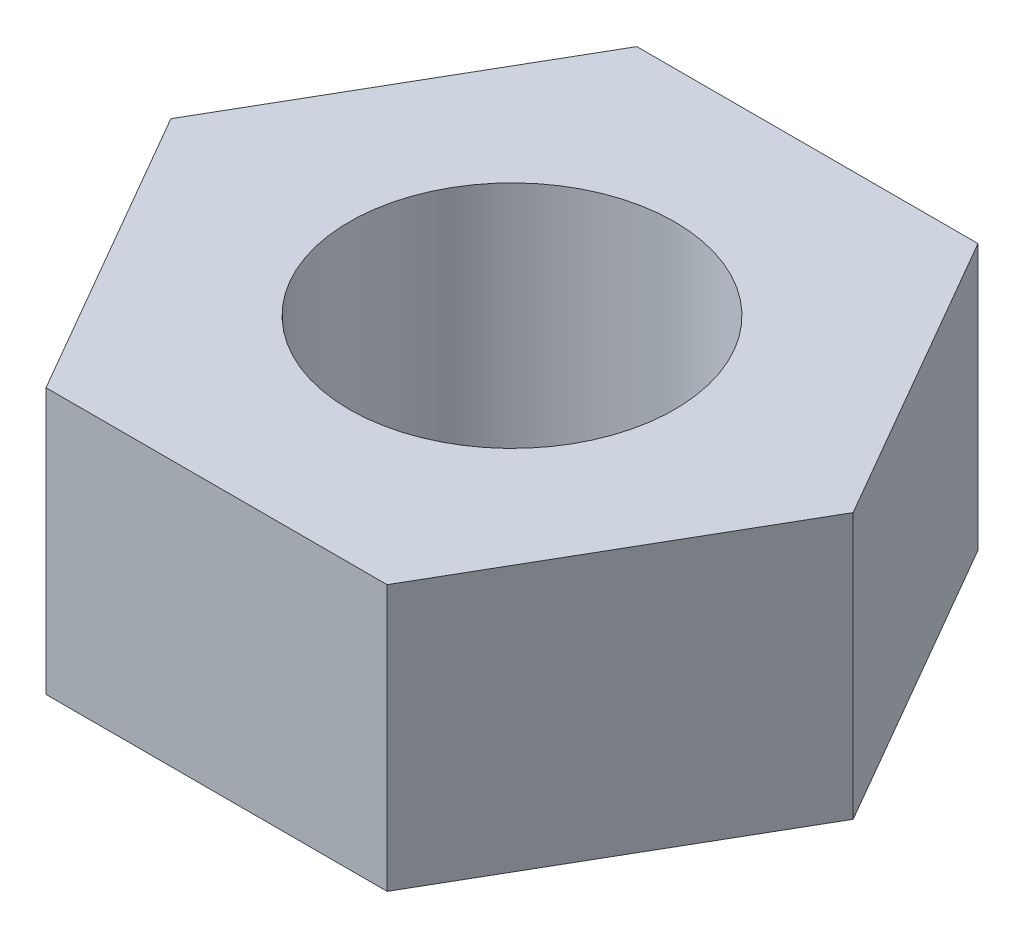
ISO-10303-21;
HEADER;
FILE_DESCRIPTION(('STEP AP214'),'2;1');
FILE_NAME('part.step','',(''),(''),'','','');
FILE_SCHEMA(('AUTOMOTIVE_DESIGN { 1 0 10303 214 1 1 1 1 }'));
ENDSEC;
DATA;
#1=APPLICATION_CONTEXT('core data for automotive mechanical design processes');
#2=APPLICATION_PROTOCOL_DEFINITION('international standard','automotive_design',2000,#1);
#3=PRODUCT_CONTEXT('',#1,'mechanical');
#4=PRODUCT('Part','Part','',(#3));
#5=PRODUCT_RELATED_PRODUCT_CATEGORY('part','',(#4));
#6=PRODUCT_DEFINITION_FORMATION('','',#4);
#7=PRODUCT_DEFINITION_CONTEXT('part definition',#1,'design');
#8=PRODUCT_DEFINITION('design','',#6,#7);
#9=PRODUCT_DEFINITION_SHAPE('','',#8);
#10=(LENGTH_UNIT() NAMED_UNIT(*) SI_UNIT(.MILLI.,.METRE.));
#11=(NAMED_UNIT(*) PLANE_ANGLE_UNIT() SI_UNIT($,.RADIAN.));
#12=(NAMED_UNIT(*) SI_UNIT($,.STERADIAN.) SOLID_ANGLE_UNIT());
#13=UNCERTAINTY_MEASURE_WITH_UNIT(LENGTH_MEASURE(1.E-05),#10,'distance_accuracy_value','');
#14=(GEOMETRIC_REPRESENTATION_CONTEXT(3) GLOBAL_UNCERTAINTY_ASSIGNED_CONTEXT((#13)) GLOBAL_UNIT_ASSIGNED_CONTEXT((#10,
#11,#12)) REPRESENTATION_CONTEXT('',''));
#15=CARTESIAN_POINT('',(0.,0.,0.));
#16=DIRECTION('',(0.,0.,1.));
#17=DIRECTION('',(1.,0.,0.));
#18=AXIS2_PLACEMENT_3D('',#15,#16,#17);
#19=CARTESIAN_POINT('',(0.,2.45,0.));
#20=DIRECTION('',(0.,1.,0.));
#21=DIRECTION('',(0.,0.,1.));
#22=AXIS2_PLACEMENT_3D('',#19,#20,#21);
#23=PLANE('',#22);
#24=DIRECTION('',(0.499999999999995,0.,-0.866025403784441));
#25=VECTOR('',#24,1.);
#26=CARTESIAN_POINT('',(1.57327948354176,2.45,2.72499999999998));
#27=LINE('',#26,#25);
#28=CARTESIAN_POINT('',(1.57327948354176,2.45,2.72499999999998));
#29=VERTEX_POINT('',#28);
#30=CARTESIAN_POINT('',(3.14655896708346,2.45,0.));
#31=VERTEX_POINT('',#30);
#32=EDGE_CURVE('E131',#29,#31,#27,.T.);
#33=ORIENTED_EDGE('',*,*,#32,.T.);
#34=DIRECTION('',(-0.500000000000001,0.,-0.866025403784438));
#35=VECTOR('',#34,1.);
#36=CARTESIAN_POINT('',(3.14655896708346,2.45,0.));
#37=LINE('',#36,#35);
#38=CARTESIAN_POINT('',(1.57327948354173,2.45,-2.72500000000001));
#39=VERTEX_POINT('',#38);
#40=EDGE_CURVE('E89',#31,#39,#37,.T.);
#41=ORIENTED_EDGE('',*,*,#40,.T.);
#42=DIRECTION('',(-1.,0.,0.));
#43=VECTOR('',#42,1.);
#44=CARTESIAN_POINT('',(1.57327948354173,2.45,-2.72500000000001));
#45=LINE('',#44,#43);
#46=CARTESIAN_POINT('',(-1.57327948354174,2.45,-2.725));
#47=VERTEX_POINT('',#46);
#48=EDGE_CURVE('E102',#39,#47,#45,.T.);
#49=ORIENTED_EDGE('',*,*,#48,.T.);
#50=DIRECTION('',(-0.499999999999995,0.,0.866025403784442));
#51=VECTOR('',#50,1.);
#52=CARTESIAN_POINT('',(-1.57327948354174,2.45,-2.725));
#53=LINE('',#52,#51);
#54=CARTESIAN_POINT('',(-3.14655896708346,2.45,0.));
#55=VERTEX_POINT('',#54);
#56=EDGE_CURVE('E96',#47,#55,#53,.T.);
#57=ORIENTED_EDGE('',*,*,#56,.T.);
#58=DIRECTION('',(0.500000000000007,0.,0.866025403784435));
#59=VECTOR('',#58,1.);
#60=CARTESIAN_POINT('',(-3.14655896708346,2.45,0.));
#61=LINE('',#60,#59);
#62=CARTESIAN_POINT('',(-1.57327948354171,2.45,2.72500000000002));
#63=VERTEX_POINT('',#62);
#64=EDGE_CURVE('E100',#55,#63,#61,.T.);
#65=ORIENTED_EDGE('',*,*,#64,.T.);
#66=DIRECTION('',(1.,0.,0.));
#67=VECTOR('',#66,1.);
#68=CARTESIAN_POINT('',(-1.57327948354171,2.45,2.72500000000002));
#69=LINE('',#68,#67);
#70=EDGE_CURVE('E52',#63,#29,#69,.T.);
#71=ORIENTED_EDGE('',*,*,#70,.T.);
#72=EDGE_LOOP('',(#33,#41,#49,#57,#65,#71));
#73=FACE_BOUND('',#72,.T.);
#74=CARTESIAN_POINT('',(0.,2.45,0.));
#75=DIRECTION('',(0.,1.,0.));
#76=DIRECTION('',(0.,0.,1.));
#77=AXIS2_PLACEMENT_3D('',#74,#75,#76);
#78=CIRCLE('',#77,1.5);
#79=CARTESIAN_POINT('',(0.,2.45,1.5));
#80=VERTEX_POINT('',#79);
#81=EDGE_CURVE('E124',#80,#80,#78,.T.);
#82=ORIENTED_EDGE('',*,*,#81,.F.);
#83=EDGE_LOOP('',(#82));
#84=FACE_BOUND('',#83,.T.);
#85=ADVANCED_FACE('F35',(#73,#84),#23,.T.);
#86=CARTESIAN_POINT('',(0.,0.,0.));
#87=DIRECTION('',(0.,1.,0.));
#88=DIRECTION('',(0.,0.,1.));
#89=AXIS2_PLACEMENT_3D('',#86,#87,#88);
#90=PLANE('',#89);
#91=DIRECTION('',(0.499999999999995,0.,-0.866025403784441));
#92=VECTOR('',#91,1.);
#93=CARTESIAN_POINT('',(1.57327948354176,0.,2.72499999999998));
#94=LINE('',#93,#92);
#95=CARTESIAN_POINT('',(1.57327948354176,0.,2.72499999999998));
#96=VERTEX_POINT('',#95);
#97=CARTESIAN_POINT('',(3.14655896708346,0.,0.));
#98=VERTEX_POINT('',#97);
#99=EDGE_CURVE('E120',#96,#98,#94,.T.);
#100=ORIENTED_EDGE('',*,*,#99,.F.);
#101=DIRECTION('',(1.,0.,0.));
#102=VECTOR('',#101,1.);
#103=CARTESIAN_POINT('',(-1.57327948354171,0.,2.72500000000002));
#104=LINE('',#103,#102);
#105=CARTESIAN_POINT('',(-1.57327948354171,0.,2.72500000000002));
#106=VERTEX_POINT('',#105);
#107=EDGE_CURVE('E81',#106,#96,#104,.T.);
#108=ORIENTED_EDGE('',*,*,#107,.F.);
#109=DIRECTION('',(0.500000000000007,0.,0.866025403784435));
#110=VECTOR('',#109,1.);
#111=CARTESIAN_POINT('',(-3.14655896708346,0.,0.));
#112=LINE('',#111,#110);
#113=CARTESIAN_POINT('',(-3.14655896708346,0.,0.));
#114=VERTEX_POINT('',#113);
#115=EDGE_CURVE('E75',#114,#106,#112,.T.);
#116=ORIENTED_EDGE('',*,*,#115,.F.);
#117=DIRECTION('',(-0.499999999999995,0.,0.866025403784442));
#118=VECTOR('',#117,1.);
#119=CARTESIAN_POINT('',(-1.57327948354174,0.,-2.725));
#120=LINE('',#119,#118);
#121=CARTESIAN_POINT('',(-1.57327948354174,0.,-2.725));
#122=VERTEX_POINT('',#121);
#123=EDGE_CURVE('E110',#122,#114,#120,.T.);
#124=ORIENTED_EDGE('',*,*,#123,.F.);
#125=DIRECTION('',(-1.,0.,0.));
#126=VECTOR('',#125,1.);
#127=CARTESIAN_POINT('',(1.57327948354173,0.,-2.72500000000001));
#128=LINE('',#127,#126);
#129=CARTESIAN_POINT('',(1.57327948354173,0.,-2.72500000000001));
#130=VERTEX_POINT('',#129);
#131=EDGE_CURVE('E126',#130,#122,#128,.T.);
#132=ORIENTED_EDGE('',*,*,#131,.F.);
#133=DIRECTION('',(-0.500000000000001,0.,-0.866025403784438));
#134=VECTOR('',#133,1.);
#135=CARTESIAN_POINT('',(3.14655896708346,0.,0.));
#136=LINE('',#135,#134);
#137=EDGE_CURVE('E123',#98,#130,#136,.T.);
#138=ORIENTED_EDGE('',*,*,#137,.F.);
#139=EDGE_LOOP('',(#100,#108,#116,#124,#132,#138));
#140=FACE_BOUND('',#139,.T.);
#141=CARTESIAN_POINT('',(0.,0.,0.));
#142=DIRECTION('',(0.,1.,0.));
#143=DIRECTION('',(0.,0.,1.));
#144=AXIS2_PLACEMENT_3D('',#141,#142,#143);
#145=CIRCLE('',#144,1.5);
#146=CARTESIAN_POINT('',(0.,0.,1.5));
#147=VERTEX_POINT('',#146);
#148=EDGE_CURVE('E224',#147,#147,#145,.T.);
#149=ORIENTED_EDGE('',*,*,#148,.T.);
#150=EDGE_LOOP('',(#149));
#151=FACE_BOUND('',#150,.T.);
#152=ADVANCED_FACE('F140',(#140,#151),#90,.F.);
#153=CARTESIAN_POINT('',(1.57327948354176,2.45,2.72499999999998));
#154=DIRECTION('',(-0.866025403784441,0.,-0.499999999999995));
#155=DIRECTION('',(-0.499999999999995,0.,0.866025403784441));
#156=AXIS2_PLACEMENT_3D('',#153,#154,#155);
#157=PLANE('',#156);
#158=ORIENTED_EDGE('',*,*,#99,.T.);
#159=DIRECTION('',(0.,-1.,0.));
#160=VECTOR('',#159,1.);
#161=CARTESIAN_POINT('',(3.14655896708346,2.45,0.));
#162=LINE('',#161,#160);
#163=EDGE_CURVE('E11',#31,#98,#162,.T.);
#164=ORIENTED_EDGE('',*,*,#163,.F.);
#165=ORIENTED_EDGE('',*,*,#32,.F.);
#166=DIRECTION('',(0.,-1.,0.));
#167=VECTOR('',#166,1.);
#168=CARTESIAN_POINT('',(1.57327948354176,2.45,2.72499999999998));
#169=LINE('',#168,#167);
#170=EDGE_CURVE('E116',#29,#96,#169,.T.);
#171=ORIENTED_EDGE('',*,*,#170,.T.);
#172=EDGE_LOOP('',(#158,#164,#165,#171));
#173=FACE_BOUND('',#172,.T.);
#174=ADVANCED_FACE('F37',(#173),#157,.F.);
#175=CARTESIAN_POINT('',(3.14655896708346,2.45,0.));
#176=DIRECTION('',(-0.866025403784438,0.,0.500000000000001));
#177=DIRECTION('',(0.500000000000001,0.,0.866025403784438));
#178=AXIS2_PLACEMENT_3D('',#175,#176,#177);
#179=PLANE('',#178);
#180=ORIENTED_EDGE('',*,*,#137,.T.);
#181=DIRECTION('',(0.,-1.,0.));
#182=VECTOR('',#181,1.);
#183=CARTESIAN_POINT('',(1.57327948354173,2.45,-2.72500000000001));
#184=LINE('',#183,#182);
#185=EDGE_CURVE('E44',#39,#130,#184,.T.);
#186=ORIENTED_EDGE('',*,*,#185,.F.);
#187=ORIENTED_EDGE('',*,*,#40,.F.);
#188=ORIENTED_EDGE('',*,*,#163,.T.);
#189=EDGE_LOOP('',(#180,#186,#187,#188));
#190=FACE_BOUND('',#189,.T.);
#191=ADVANCED_FACE('F165',(#190),#179,.F.);
#192=CARTESIAN_POINT('',(1.57327948354173,2.45,-2.72500000000001));
#193=DIRECTION('',(0.,0.,1.));
#194=DIRECTION('',(1.,0.,0.));
#195=AXIS2_PLACEMENT_3D('',#192,#193,#194);
#196=PLANE('',#195);
#197=ORIENTED_EDGE('',*,*,#131,.T.);
#198=DIRECTION('',(0.,-1.,0.));
#199=VECTOR('',#198,1.);
#200=CARTESIAN_POINT('',(-1.57327948354174,2.45,-2.725));
#201=LINE('',#200,#199);
#202=EDGE_CURVE('E111',#47,#122,#201,.T.);
#203=ORIENTED_EDGE('',*,*,#202,.F.);
#204=ORIENTED_EDGE('',*,*,#48,.F.);
#205=ORIENTED_EDGE('',*,*,#185,.T.);
#206=EDGE_LOOP('',(#197,#203,#204,#205));
#207=FACE_BOUND('',#206,.T.);
#208=ADVANCED_FACE('F137',(#207),#196,.F.);
#209=CARTESIAN_POINT('',(-1.57327948354174,2.45,-2.725));
#210=DIRECTION('',(0.866025403784442,0.,0.499999999999995));
#211=DIRECTION('',(0.499999999999995,0.,-0.866025403784442));
#212=AXIS2_PLACEMENT_3D('',#209,#210,#211);
#213=PLANE('',#212);
#214=ORIENTED_EDGE('',*,*,#123,.T.);
#215=DIRECTION('',(0.,-1.,0.));
#216=VECTOR('',#215,1.);
#217=CARTESIAN_POINT('',(-3.14655896708346,2.45,0.));
#218=LINE('',#217,#216);
#219=EDGE_CURVE('E107',#55,#114,#218,.T.);
#220=ORIENTED_EDGE('',*,*,#219,.F.);
#221=ORIENTED_EDGE('',*,*,#56,.F.);
#222=ORIENTED_EDGE('',*,*,#202,.T.);
#223=EDGE_LOOP('',(#214,#220,#221,#222));
#224=FACE_BOUND('',#223,.T.);
#225=ADVANCED_FACE('F108',(#224),#213,.F.);
#226=CARTESIAN_POINT('',(-3.14655896708346,2.45,0.));
#227=DIRECTION('',(0.866025403784434,0.,-0.500000000000007));
#228=DIRECTION('',(-0.500000000000007,0.,-0.866025403784435));
#229=AXIS2_PLACEMENT_3D('',#226,#227,#228);
#230=PLANE('',#229);
#231=ORIENTED_EDGE('',*,*,#115,.T.);
#232=DIRECTION('',(0.,-1.,0.));
#233=VECTOR('',#232,1.);
#234=CARTESIAN_POINT('',(-1.57327948354171,2.45,2.72500000000002));
#235=LINE('',#234,#233);
#236=EDGE_CURVE('E112',#63,#106,#235,.T.);
#237=ORIENTED_EDGE('',*,*,#236,.F.);
#238=ORIENTED_EDGE('',*,*,#64,.F.);
#239=ORIENTED_EDGE('',*,*,#219,.T.);
#240=EDGE_LOOP('',(#231,#237,#238,#239));
#241=FACE_BOUND('',#240,.T.);
#242=ADVANCED_FACE('F114',(#241),#230,.F.);
#243=CARTESIAN_POINT('',(-1.57327948354171,2.45,2.72500000000002));
#244=DIRECTION('',(0.,0.,-1.));
#245=DIRECTION('',(-1.,0.,0.));
#246=AXIS2_PLACEMENT_3D('',#243,#244,#245);
#247=PLANE('',#246);
#248=ORIENTED_EDGE('',*,*,#107,.T.);
#249=ORIENTED_EDGE('',*,*,#170,.F.);
#250=ORIENTED_EDGE('',*,*,#70,.F.);
#251=ORIENTED_EDGE('',*,*,#236,.T.);
#252=EDGE_LOOP('',(#248,#249,#250,#251));
#253=FACE_BOUND('',#252,.T.);
#254=ADVANCED_FACE('F145',(#253),#247,.F.);
#255=CARTESIAN_POINT('',(0.,2.45,0.));
#256=DIRECTION('',(0.,-1.,0.));
#257=DIRECTION('',(0.,0.,-1.));
#258=AXIS2_PLACEMENT_3D('',#255,#256,#257);
#259=CYLINDRICAL_SURFACE('',#258,1.5);
#260=ORIENTED_EDGE('',*,*,#81,.T.);
#261=EDGE_LOOP('',(#260));
#262=FACE_BOUND('',#261,.T.);
#263=ORIENTED_EDGE('',*,*,#148,.F.);
#264=EDGE_LOOP('',(#263));
#265=FACE_BOUND('',#264,.T.);
#266=ADVANCED_FACE('F147',(#262,#265),#259,.F.);
#267=CLOSED_SHELL('',(#85,#152,#174,#191,#208,#225,#242,#254,#266));
#268=MANIFOLD_SOLID_BREP('B2',#267);
#269=ADVANCED_BREP_SHAPE_REPRESENTATION('',(#18,#268),#14);
#270=SHAPE_DEFINITION_REPRESENTATION(#9,#269);
ENDSEC;
END-ISO-10303-21;
